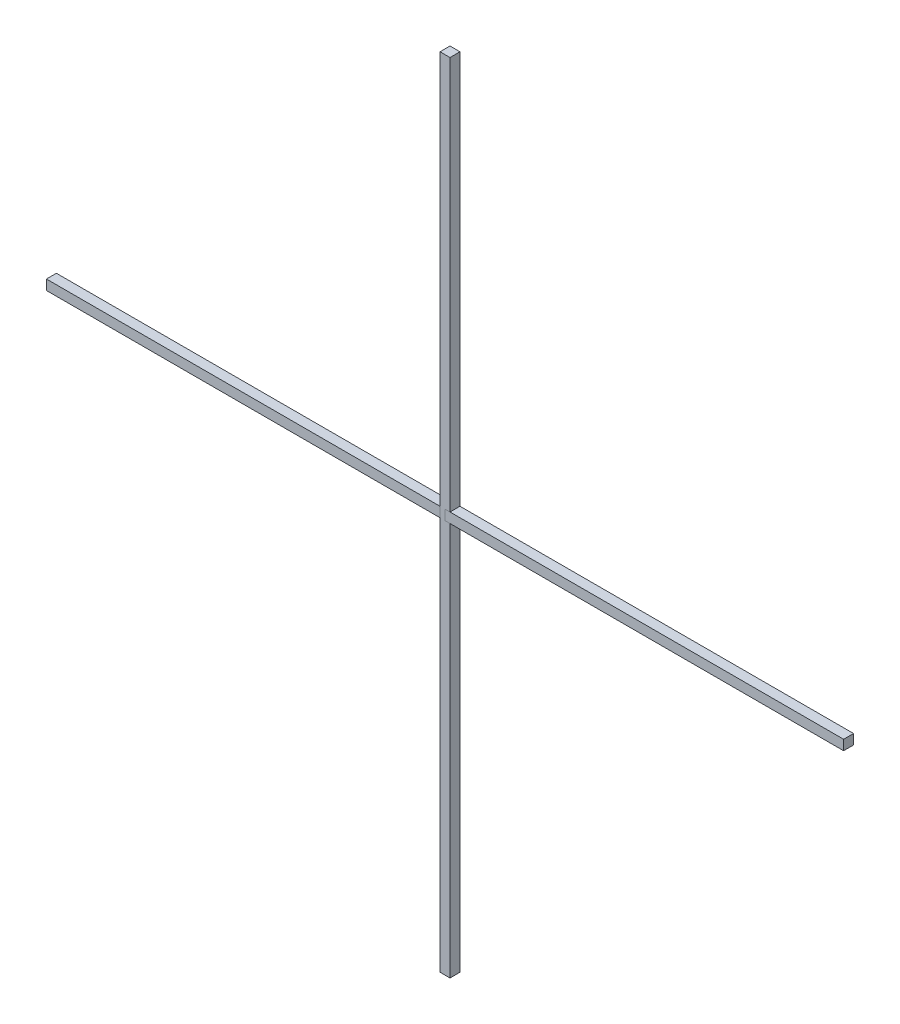
ISO-10303-21;
HEADER;
FILE_DESCRIPTION(('STEP AP214'),'2;1');
FILE_NAME('part.step','',(''),(''),'','','');
FILE_SCHEMA(('AUTOMOTIVE_DESIGN { 1 0 10303 214 1 1 1 1 }'));
ENDSEC;
DATA;
#1=APPLICATION_CONTEXT('core data for automotive mechanical design processes');
#2=APPLICATION_PROTOCOL_DEFINITION('international standard','automotive_design',2000,#1);
#3=PRODUCT_CONTEXT('',#1,'mechanical');
#4=PRODUCT('Part','Part','',(#3));
#5=PRODUCT_RELATED_PRODUCT_CATEGORY('part','',(#4));
#6=PRODUCT_DEFINITION_FORMATION('','',#4);
#7=PRODUCT_DEFINITION_CONTEXT('part definition',#1,'design');
#8=PRODUCT_DEFINITION('design','',#6,#7);
#9=PRODUCT_DEFINITION_SHAPE('','',#8);
#10=(LENGTH_UNIT() NAMED_UNIT(*) SI_UNIT(.MILLI.,.METRE.));
#11=(NAMED_UNIT(*) PLANE_ANGLE_UNIT() SI_UNIT($,.RADIAN.));
#12=(NAMED_UNIT(*) SI_UNIT($,.STERADIAN.) SOLID_ANGLE_UNIT());
#13=UNCERTAINTY_MEASURE_WITH_UNIT(LENGTH_MEASURE(1.E-05),#10,'distance_accuracy_value','');
#14=(GEOMETRIC_REPRESENTATION_CONTEXT(3) GLOBAL_UNCERTAINTY_ASSIGNED_CONTEXT((#13)) GLOBAL_UNIT_ASSIGNED_CONTEXT((#10,
#11,#12)) REPRESENTATION_CONTEXT('',''));
#15=CARTESIAN_POINT('',(0.,0.,0.));
#16=DIRECTION('',(0.,0.,1.));
#17=DIRECTION('',(1.,0.,0.));
#18=AXIS2_PLACEMENT_3D('',#15,#16,#17);
#19=CARTESIAN_POINT('',(62.5,5000.,-62.5));
#20=DIRECTION('',(-1.,0.,0.));
#21=DIRECTION('',(0.,0.,1.));
#22=AXIS2_PLACEMENT_3D('',#19,#20,#21);
#23=PLANE('',#22);
#24=DIRECTION('',(0.,0.,-1.));
#25=VECTOR('',#24,1.);
#26=CARTESIAN_POINT('',(62.5,-5000.,-62.5));
#27=LINE('',#26,#25);
#28=CARTESIAN_POINT('',(62.5,-5000.,62.5));
#29=VERTEX_POINT('',#28);
#30=CARTESIAN_POINT('',(62.5,-5000.,-62.5));
#31=VERTEX_POINT('',#30);
#32=EDGE_CURVE('E139',#29,#31,#27,.T.);
#33=ORIENTED_EDGE('',*,*,#32,.T.);
#34=DIRECTION('',(0.,-1.,0.));
#35=VECTOR('',#34,1.);
#36=CARTESIAN_POINT('',(62.5,5000.,-62.5));
#37=LINE('',#36,#35);
#38=CARTESIAN_POINT('',(62.5,5000.,-62.5));
#39=VERTEX_POINT('',#38);
#40=EDGE_CURVE('E13',#39,#31,#37,.T.);
#41=ORIENTED_EDGE('',*,*,#40,.F.);
#42=DIRECTION('',(0.,0.,-1.));
#43=VECTOR('',#42,1.);
#44=CARTESIAN_POINT('',(62.5,5000.,-62.5));
#45=LINE('',#44,#43);
#46=CARTESIAN_POINT('',(62.5,5000.,62.5));
#47=VERTEX_POINT('',#46);
#48=EDGE_CURVE('E127',#47,#39,#45,.T.);
#49=ORIENTED_EDGE('',*,*,#48,.F.);
#50=DIRECTION('',(0.,-1.,0.));
#51=VECTOR('',#50,1.);
#52=CARTESIAN_POINT('',(62.5,5000.,62.5));
#53=LINE('',#52,#51);
#54=EDGE_CURVE('E135',#47,#29,#53,.T.);
#55=ORIENTED_EDGE('',*,*,#54,.T.);
#56=EDGE_LOOP('',(#33,#41,#49,#55));
#57=FACE_BOUND('',#56,.T.);
#58=ADVANCED_FACE('F76',(#57),#23,.F.);
#59=CARTESIAN_POINT('',(-62.5,5000.,-62.5));
#60=DIRECTION('',(0.,0.,1.));
#61=DIRECTION('',(1.,0.,0.));
#62=AXIS2_PLACEMENT_3D('',#59,#60,#61);
#63=PLANE('',#62);
#64=DIRECTION('',(-1.,0.,0.));
#65=VECTOR('',#64,1.);
#66=CARTESIAN_POINT('',(-62.5,-5000.,-62.5));
#67=LINE('',#66,#65);
#68=CARTESIAN_POINT('',(-62.5,-5000.,-62.5));
#69=VERTEX_POINT('',#68);
#70=EDGE_CURVE('E131',#31,#69,#67,.T.);
#71=ORIENTED_EDGE('',*,*,#70,.T.);
#72=DIRECTION('',(0.,-1.,0.));
#73=VECTOR('',#72,1.);
#74=CARTESIAN_POINT('',(-62.5,5000.,-62.5));
#75=LINE('',#74,#73);
#76=CARTESIAN_POINT('',(-62.5,5000.,-62.5));
#77=VERTEX_POINT('',#76);
#78=EDGE_CURVE('E84',#77,#69,#75,.T.);
#79=ORIENTED_EDGE('',*,*,#78,.F.);
#80=DIRECTION('',(-1.,0.,0.));
#81=VECTOR('',#80,1.);
#82=CARTESIAN_POINT('',(-62.5,5000.,-62.5));
#83=LINE('',#82,#81);
#84=EDGE_CURVE('E122',#39,#77,#83,.T.);
#85=ORIENTED_EDGE('',*,*,#84,.F.);
#86=ORIENTED_EDGE('',*,*,#40,.T.);
#87=EDGE_LOOP('',(#71,#79,#85,#86));
#88=FACE_BOUND('',#87,.T.);
#89=ADVANCED_FACE('F130',(#88),#63,.F.);
#90=CARTESIAN_POINT('',(-62.5,5000.,-62.5));
#91=DIRECTION('',(1.,0.,0.));
#92=DIRECTION('',(0.,0.,-1.));
#93=AXIS2_PLACEMENT_3D('',#90,#91,#92);
#94=PLANE('',#93);
#95=DIRECTION('',(0.,0.,1.));
#96=VECTOR('',#95,1.);
#97=CARTESIAN_POINT('',(-62.5,-5000.,-62.5));
#98=LINE('',#97,#96);
#99=CARTESIAN_POINT('',(-62.5,-5000.,62.5));
#100=VERTEX_POINT('',#99);
#101=EDGE_CURVE('E109',#69,#100,#98,.T.);
#102=ORIENTED_EDGE('',*,*,#101,.T.);
#103=DIRECTION('',(0.,-1.,0.));
#104=VECTOR('',#103,1.);
#105=CARTESIAN_POINT('',(-62.5,5000.,62.5));
#106=LINE('',#105,#104);
#107=CARTESIAN_POINT('',(-62.5,5000.,62.5));
#108=VERTEX_POINT('',#107);
#109=EDGE_CURVE('E132',#108,#100,#106,.T.);
#110=ORIENTED_EDGE('',*,*,#109,.F.);
#111=DIRECTION('',(0.,0.,1.));
#112=VECTOR('',#111,1.);
#113=CARTESIAN_POINT('',(-62.5,5000.,-62.5));
#114=LINE('',#113,#112);
#115=EDGE_CURVE('E125',#77,#108,#114,.T.);
#116=ORIENTED_EDGE('',*,*,#115,.F.);
#117=ORIENTED_EDGE('',*,*,#78,.T.);
#118=EDGE_LOOP('',(#102,#110,#116,#117));
#119=FACE_BOUND('',#118,.T.);
#120=ADVANCED_FACE('F133',(#119),#94,.F.);
#121=CARTESIAN_POINT('',(-62.5,5000.,62.5));
#122=DIRECTION('',(0.,0.,-1.));
#123=DIRECTION('',(-1.,0.,0.));
#124=AXIS2_PLACEMENT_3D('',#121,#122,#123);
#125=PLANE('',#124);
#126=DIRECTION('',(1.,0.,0.));
#127=VECTOR('',#126,1.);
#128=CARTESIAN_POINT('',(-62.5,-5000.,62.5));
#129=LINE('',#128,#127);
#130=EDGE_CURVE('E115',#100,#29,#129,.T.);
#131=ORIENTED_EDGE('',*,*,#130,.T.);
#132=ORIENTED_EDGE('',*,*,#54,.F.);
#133=DIRECTION('',(1.,0.,0.));
#134=VECTOR('',#133,1.);
#135=CARTESIAN_POINT('',(-62.5,5000.,62.5));
#136=LINE('',#135,#134);
#137=EDGE_CURVE('E92',#108,#47,#136,.T.);
#138=ORIENTED_EDGE('',*,*,#137,.F.);
#139=ORIENTED_EDGE('',*,*,#109,.T.);
#140=EDGE_LOOP('',(#131,#132,#138,#139));
#141=FACE_BOUND('',#140,.T.);
#142=ADVANCED_FACE('F146',(#141),#125,.F.);
#143=CARTESIAN_POINT('',(62.5,5000.,62.5));
#144=DIRECTION('',(0.,1.,0.));
#145=DIRECTION('',(0.,0.,1.));
#146=AXIS2_PLACEMENT_3D('',#143,#144,#145);
#147=PLANE('',#146);
#148=ORIENTED_EDGE('',*,*,#48,.T.);
#149=ORIENTED_EDGE('',*,*,#84,.T.);
#150=ORIENTED_EDGE('',*,*,#115,.T.);
#151=ORIENTED_EDGE('',*,*,#137,.T.);
#152=EDGE_LOOP('',(#148,#149,#150,#151));
#153=FACE_BOUND('',#152,.T.);
#154=ADVANCED_FACE('F123',(#153),#147,.T.);
#155=CARTESIAN_POINT('',(62.5,-5000.,62.5));
#156=DIRECTION('',(0.,1.,0.));
#157=DIRECTION('',(0.,0.,1.));
#158=AXIS2_PLACEMENT_3D('',#155,#156,#157);
#159=PLANE('',#158);
#160=ORIENTED_EDGE('',*,*,#32,.F.);
#161=ORIENTED_EDGE('',*,*,#130,.F.);
#162=ORIENTED_EDGE('',*,*,#101,.F.);
#163=ORIENTED_EDGE('',*,*,#70,.F.);
#164=EDGE_LOOP('',(#160,#161,#162,#163));
#165=FACE_BOUND('',#164,.T.);
#166=ADVANCED_FACE('F149',(#165),#159,.F.);
#167=CLOSED_SHELL('',(#58,#89,#120,#142,#154,#166));
#168=MANIFOLD_SOLID_BREP('B2',#167);
#169=CARTESIAN_POINT('',(5000.,-62.5,-62.5));
#170=DIRECTION('',(0.,1.,0.));
#171=DIRECTION('',(0.,0.,1.));
#172=AXIS2_PLACEMENT_3D('',#169,#170,#171);
#173=PLANE('',#172);
#174=DIRECTION('',(0.,0.,-1.));
#175=VECTOR('',#174,1.);
#176=CARTESIAN_POINT('',(-5000.,-62.5,-62.5));
#177=LINE('',#176,#175);
#178=CARTESIAN_POINT('',(-5000.,-62.5,62.5));
#179=VERTEX_POINT('',#178);
#180=CARTESIAN_POINT('',(-5000.,-62.5,-62.5));
#181=VERTEX_POINT('',#180);
#182=EDGE_CURVE('E274',#179,#181,#177,.T.);
#183=ORIENTED_EDGE('',*,*,#182,.T.);
#184=DIRECTION('',(-1.,0.,0.));
#185=VECTOR('',#184,1.);
#186=CARTESIAN_POINT('',(5000.,-62.5,-62.5));
#187=LINE('',#186,#185);
#188=CARTESIAN_POINT('',(5000.,-62.5,-62.5));
#189=VERTEX_POINT('',#188);
#190=EDGE_CURVE('E74',#189,#181,#187,.T.);
#191=ORIENTED_EDGE('',*,*,#190,.F.);
#192=DIRECTION('',(0.,0.,-1.));
#193=VECTOR('',#192,1.);
#194=CARTESIAN_POINT('',(5000.,-62.5,-62.5));
#195=LINE('',#194,#193);
#196=CARTESIAN_POINT('',(5000.,-62.5,62.5));
#197=VERTEX_POINT('',#196);
#198=EDGE_CURVE('E262',#197,#189,#195,.T.);
#199=ORIENTED_EDGE('',*,*,#198,.F.);
#200=DIRECTION('',(-1.,0.,0.));
#201=VECTOR('',#200,1.);
#202=CARTESIAN_POINT('',(5000.,-62.5,62.5));
#203=LINE('',#202,#201);
#204=EDGE_CURVE('E270',#197,#179,#203,.T.);
#205=ORIENTED_EDGE('',*,*,#204,.T.);
#206=EDGE_LOOP('',(#183,#191,#199,#205));
#207=FACE_BOUND('',#206,.T.);
#208=ADVANCED_FACE('F211',(#207),#173,.F.);
#209=CARTESIAN_POINT('',(5000.,62.5,-62.5));
#210=DIRECTION('',(0.,0.,1.));
#211=DIRECTION('',(0.,-1.,0.));
#212=AXIS2_PLACEMENT_3D('',#209,#210,#211);
#213=PLANE('',#212);
#214=DIRECTION('',(0.,1.,0.));
#215=VECTOR('',#214,1.);
#216=CARTESIAN_POINT('',(-5000.,62.5,-62.5));
#217=LINE('',#216,#215);
#218=CARTESIAN_POINT('',(-5000.,62.5,-62.5));
#219=VERTEX_POINT('',#218);
#220=EDGE_CURVE('E266',#181,#219,#217,.T.);
#221=ORIENTED_EDGE('',*,*,#220,.T.);
#222=DIRECTION('',(-1.,0.,0.));
#223=VECTOR('',#222,1.);
#224=CARTESIAN_POINT('',(5000.,62.5,-62.5));
#225=LINE('',#224,#223);
#226=CARTESIAN_POINT('',(5000.,62.5,-62.5));
#227=VERTEX_POINT('',#226);
#228=EDGE_CURVE('E219',#227,#219,#225,.T.);
#229=ORIENTED_EDGE('',*,*,#228,.F.);
#230=DIRECTION('',(0.,1.,0.));
#231=VECTOR('',#230,1.);
#232=CARTESIAN_POINT('',(5000.,62.5,-62.5));
#233=LINE('',#232,#231);
#234=EDGE_CURVE('E257',#189,#227,#233,.T.);
#235=ORIENTED_EDGE('',*,*,#234,.F.);
#236=ORIENTED_EDGE('',*,*,#190,.T.);
#237=EDGE_LOOP('',(#221,#229,#235,#236));
#238=FACE_BOUND('',#237,.T.);
#239=ADVANCED_FACE('F265',(#238),#213,.F.);
#240=CARTESIAN_POINT('',(5000.,62.5,-62.5));
#241=DIRECTION('',(0.,-1.,0.));
#242=DIRECTION('',(0.,0.,-1.));
#243=AXIS2_PLACEMENT_3D('',#240,#241,#242);
#244=PLANE('',#243);
#245=DIRECTION('',(0.,0.,1.));
#246=VECTOR('',#245,1.);
#247=CARTESIAN_POINT('',(-5000.,62.5,-62.5));
#248=LINE('',#247,#246);
#249=CARTESIAN_POINT('',(-5000.,62.5,62.5));
#250=VERTEX_POINT('',#249);
#251=EDGE_CURVE('E244',#219,#250,#248,.T.);
#252=ORIENTED_EDGE('',*,*,#251,.T.);
#253=DIRECTION('',(-1.,0.,0.));
#254=VECTOR('',#253,1.);
#255=CARTESIAN_POINT('',(5000.,62.5,62.5));
#256=LINE('',#255,#254);
#257=CARTESIAN_POINT('',(5000.,62.5,62.5));
#258=VERTEX_POINT('',#257);
#259=EDGE_CURVE('E267',#258,#250,#256,.T.);
#260=ORIENTED_EDGE('',*,*,#259,.F.);
#261=DIRECTION('',(0.,0.,1.));
#262=VECTOR('',#261,1.);
#263=CARTESIAN_POINT('',(5000.,62.5,-62.5));
#264=LINE('',#263,#262);
#265=EDGE_CURVE('E260',#227,#258,#264,.T.);
#266=ORIENTED_EDGE('',*,*,#265,.F.);
#267=ORIENTED_EDGE('',*,*,#228,.T.);
#268=EDGE_LOOP('',(#252,#260,#266,#267));
#269=FACE_BOUND('',#268,.T.);
#270=ADVANCED_FACE('F268',(#269),#244,.F.);
#271=CARTESIAN_POINT('',(5000.,62.5,62.5));
#272=DIRECTION('',(0.,0.,-1.));
#273=DIRECTION('',(0.,1.,0.));
#274=AXIS2_PLACEMENT_3D('',#271,#272,#273);
#275=PLANE('',#274);
#276=DIRECTION('',(0.,-1.,0.));
#277=VECTOR('',#276,1.);
#278=CARTESIAN_POINT('',(-5000.,62.5,62.5));
#279=LINE('',#278,#277);
#280=EDGE_CURVE('E250',#250,#179,#279,.T.);
#281=ORIENTED_EDGE('',*,*,#280,.T.);
#282=ORIENTED_EDGE('',*,*,#204,.F.);
#283=DIRECTION('',(0.,-1.,0.));
#284=VECTOR('',#283,1.);
#285=CARTESIAN_POINT('',(5000.,62.5,62.5));
#286=LINE('',#285,#284);
#287=EDGE_CURVE('E227',#258,#197,#286,.T.);
#288=ORIENTED_EDGE('',*,*,#287,.F.);
#289=ORIENTED_EDGE('',*,*,#259,.T.);
#290=EDGE_LOOP('',(#281,#282,#288,#289));
#291=FACE_BOUND('',#290,.T.);
#292=ADVANCED_FACE('F281',(#291),#275,.F.);
#293=CARTESIAN_POINT('',(5000.,-62.5,62.5));
#294=DIRECTION('',(1.,0.,0.));
#295=DIRECTION('',(0.,0.,-1.));
#296=AXIS2_PLACEMENT_3D('',#293,#294,#295);
#297=PLANE('',#296);
#298=ORIENTED_EDGE('',*,*,#198,.T.);
#299=ORIENTED_EDGE('',*,*,#234,.T.);
#300=ORIENTED_EDGE('',*,*,#265,.T.);
#301=ORIENTED_EDGE('',*,*,#287,.T.);
#302=EDGE_LOOP('',(#298,#299,#300,#301));
#303=FACE_BOUND('',#302,.T.);
#304=ADVANCED_FACE('F258',(#303),#297,.T.);
#305=CARTESIAN_POINT('',(-5000.,-62.5,62.5));
#306=DIRECTION('',(1.,0.,0.));
#307=DIRECTION('',(0.,0.,-1.));
#308=AXIS2_PLACEMENT_3D('',#305,#306,#307);
#309=PLANE('',#308);
#310=ORIENTED_EDGE('',*,*,#182,.F.);
#311=ORIENTED_EDGE('',*,*,#280,.F.);
#312=ORIENTED_EDGE('',*,*,#251,.F.);
#313=ORIENTED_EDGE('',*,*,#220,.F.);
#314=EDGE_LOOP('',(#310,#311,#312,#313));
#315=FACE_BOUND('',#314,.T.);
#316=ADVANCED_FACE('F284',(#315),#309,.F.);
#317=CLOSED_SHELL('',(#208,#239,#270,#292,#304,#316));
#318=MANIFOLD_SOLID_BREP('B7',#317);
#319=ADVANCED_BREP_SHAPE_REPRESENTATION('',(#18,#168,#318),#14);
#320=SHAPE_DEFINITION_REPRESENTATION(#9,#319);
ENDSEC;
END-ISO-10303-21;
